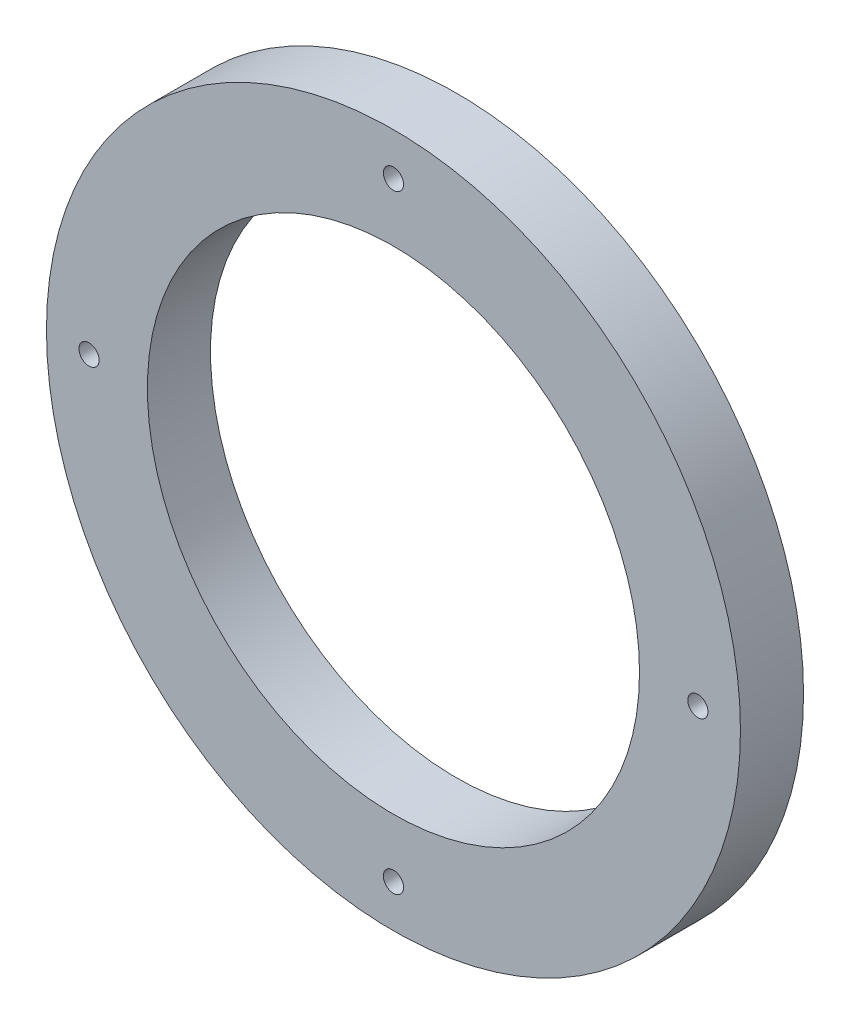
ISO-10303-21;
HEADER;
FILE_DESCRIPTION(('STEP AP214'),'2;1');
FILE_NAME('part.step','',(''),(''),'','','');
FILE_SCHEMA(('AUTOMOTIVE_DESIGN { 1 0 10303 214 1 1 1 1 }'));
ENDSEC;
DATA;
#1=APPLICATION_CONTEXT('core data for automotive mechanical design processes');
#2=APPLICATION_PROTOCOL_DEFINITION('international standard','automotive_design',2000,#1);
#3=PRODUCT_CONTEXT('',#1,'mechanical');
#4=PRODUCT('Part','Part','',(#3));
#5=PRODUCT_RELATED_PRODUCT_CATEGORY('part','',(#4));
#6=PRODUCT_DEFINITION_FORMATION('','',#4);
#7=PRODUCT_DEFINITION_CONTEXT('part definition',#1,'design');
#8=PRODUCT_DEFINITION('design','',#6,#7);
#9=PRODUCT_DEFINITION_SHAPE('','',#8);
#10=(LENGTH_UNIT() NAMED_UNIT(*) SI_UNIT(.MILLI.,.METRE.));
#11=(NAMED_UNIT(*) PLANE_ANGLE_UNIT() SI_UNIT($,.RADIAN.));
#12=(NAMED_UNIT(*) SI_UNIT($,.STERADIAN.) SOLID_ANGLE_UNIT());
#13=UNCERTAINTY_MEASURE_WITH_UNIT(LENGTH_MEASURE(1.E-05),#10,'distance_accuracy_value','');
#14=(GEOMETRIC_REPRESENTATION_CONTEXT(3) GLOBAL_UNCERTAINTY_ASSIGNED_CONTEXT((#13)) GLOBAL_UNIT_ASSIGNED_CONTEXT((#10,
#11,#12)) REPRESENTATION_CONTEXT('',''));
#15=CARTESIAN_POINT('',(0.,0.,0.));
#16=DIRECTION('',(0.,0.,1.));
#17=DIRECTION('',(1.,0.,0.));
#18=AXIS2_PLACEMENT_3D('',#15,#16,#17);
#19=CARTESIAN_POINT('',(0.,0.,10.));
#20=DIRECTION('',(0.,0.,1.));
#21=DIRECTION('',(1.,0.,0.));
#22=AXIS2_PLACEMENT_3D('',#19,#20,#21);
#23=PLANE('',#22);
#24=CARTESIAN_POINT('',(-3.36927949198362E-13,-48.25,10.));
#25=DIRECTION('',(0.,0.,1.));
#26=DIRECTION('',(1.,0.,0.));
#27=AXIS2_PLACEMENT_3D('',#24,#25,#26);
#28=CIRCLE('',#27,1.6);
#29=CARTESIAN_POINT('',(1.59999999999966,-48.25,10.));
#30=VERTEX_POINT('',#29);
#31=EDGE_CURVE('E67',#30,#30,#28,.T.);
#32=ORIENTED_EDGE('',*,*,#31,.F.);
#33=EDGE_LOOP('',(#32));
#34=FACE_BOUND('',#33,.T.);
#35=CARTESIAN_POINT('',(0.,48.25,10.));
#36=DIRECTION('',(0.,0.,1.));
#37=DIRECTION('',(1.,0.,0.));
#38=AXIS2_PLACEMENT_3D('',#35,#36,#37);
#39=CIRCLE('',#38,1.6);
#40=CARTESIAN_POINT('',(1.6,48.25,10.));
#41=VERTEX_POINT('',#40);
#42=EDGE_CURVE('E55',#41,#41,#39,.T.);
#43=ORIENTED_EDGE('',*,*,#42,.F.);
#44=EDGE_LOOP('',(#43));
#45=FACE_BOUND('',#44,.T.);
#46=CARTESIAN_POINT('',(0.,0.,10.));
#47=DIRECTION('',(0.,0.,1.));
#48=DIRECTION('',(1.,0.,0.));
#49=AXIS2_PLACEMENT_3D('',#46,#47,#48);
#50=CIRCLE('',#49,55.);
#51=CARTESIAN_POINT('',(55.,0.,10.));
#52=VERTEX_POINT('',#51);
#53=EDGE_CURVE('E10',#52,#52,#50,.T.);
#54=ORIENTED_EDGE('',*,*,#53,.T.);
#55=EDGE_LOOP('',(#54));
#56=FACE_BOUND('',#55,.T.);
#57=CARTESIAN_POINT('',(0.,0.,10.));
#58=DIRECTION('',(0.,0.,1.));
#59=DIRECTION('',(1.,0.,0.));
#60=AXIS2_PLACEMENT_3D('',#57,#58,#59);
#61=CIRCLE('',#60,39.);
#62=CARTESIAN_POINT('',(39.,0.,10.));
#63=VERTEX_POINT('',#62);
#64=EDGE_CURVE('E50',#63,#63,#61,.T.);
#65=ORIENTED_EDGE('',*,*,#64,.F.);
#66=EDGE_LOOP('',(#65));
#67=FACE_BOUND('',#66,.T.);
#68=CARTESIAN_POINT('',(48.25,-1.68463974599181E-13,10.));
#69=DIRECTION('',(0.,0.,1.));
#70=DIRECTION('',(1.,0.,0.));
#71=AXIS2_PLACEMENT_3D('',#68,#69,#70);
#72=CIRCLE('',#71,1.6);
#73=CARTESIAN_POINT('',(49.85,-1.68463974599181E-13,10.));
#74=VERTEX_POINT('',#73);
#75=EDGE_CURVE('E61',#74,#74,#72,.T.);
#76=ORIENTED_EDGE('',*,*,#75,.F.);
#77=EDGE_LOOP('',(#76));
#78=FACE_BOUND('',#77,.T.);
#79=CARTESIAN_POINT('',(-48.25,5.05391923797544E-13,10.));
#80=DIRECTION('',(0.,0.,1.));
#81=DIRECTION('',(1.,0.,0.));
#82=AXIS2_PLACEMENT_3D('',#79,#80,#81);
#83=CIRCLE('',#82,1.6);
#84=CARTESIAN_POINT('',(-46.65,5.05391923797544E-13,10.));
#85=VERTEX_POINT('',#84);
#86=EDGE_CURVE('E73',#85,#85,#83,.T.);
#87=ORIENTED_EDGE('',*,*,#86,.F.);
#88=EDGE_LOOP('',(#87));
#89=FACE_BOUND('',#88,.T.);
#90=ADVANCED_FACE('F39',(#34,#45,#56,#67,#78,#89),#23,.T.);
#91=CARTESIAN_POINT('',(0.,0.,0.));
#92=DIRECTION('',(0.,0.,1.));
#93=DIRECTION('',(1.,0.,0.));
#94=AXIS2_PLACEMENT_3D('',#91,#92,#93);
#95=PLANE('',#94);
#96=CARTESIAN_POINT('',(0.,0.,0.));
#97=DIRECTION('',(0.,0.,1.));
#98=DIRECTION('',(1.,0.,0.));
#99=AXIS2_PLACEMENT_3D('',#96,#97,#98);
#100=CIRCLE('',#99,55.);
#101=CARTESIAN_POINT('',(55.,0.,0.));
#102=VERTEX_POINT('',#101);
#103=EDGE_CURVE('E43',#102,#102,#100,.T.);
#104=ORIENTED_EDGE('',*,*,#103,.F.);
#105=EDGE_LOOP('',(#104));
#106=FACE_BOUND('',#105,.T.);
#107=CARTESIAN_POINT('',(0.,0.,0.));
#108=DIRECTION('',(0.,0.,1.));
#109=DIRECTION('',(1.,0.,0.));
#110=AXIS2_PLACEMENT_3D('',#107,#108,#109);
#111=CIRCLE('',#110,39.);
#112=CARTESIAN_POINT('',(39.,0.,0.));
#113=VERTEX_POINT('',#112);
#114=EDGE_CURVE('E52',#113,#113,#111,.T.);
#115=ORIENTED_EDGE('',*,*,#114,.T.);
#116=EDGE_LOOP('',(#115));
#117=FACE_BOUND('',#116,.T.);
#118=CARTESIAN_POINT('',(0.,48.25,0.));
#119=DIRECTION('',(0.,0.,1.));
#120=DIRECTION('',(1.,0.,0.));
#121=AXIS2_PLACEMENT_3D('',#118,#119,#120);
#122=CIRCLE('',#121,1.6);
#123=CARTESIAN_POINT('',(1.6,48.25,0.));
#124=VERTEX_POINT('',#123);
#125=EDGE_CURVE('E58',#124,#124,#122,.T.);
#126=ORIENTED_EDGE('',*,*,#125,.T.);
#127=EDGE_LOOP('',(#126));
#128=FACE_BOUND('',#127,.T.);
#129=CARTESIAN_POINT('',(48.25,-1.68463974599181E-13,0.));
#130=DIRECTION('',(0.,0.,1.));
#131=DIRECTION('',(1.,0.,0.));
#132=AXIS2_PLACEMENT_3D('',#129,#130,#131);
#133=CIRCLE('',#132,1.6);
#134=CARTESIAN_POINT('',(49.85,-1.68463974599181E-13,0.));
#135=VERTEX_POINT('',#134);
#136=EDGE_CURVE('E64',#135,#135,#133,.T.);
#137=ORIENTED_EDGE('',*,*,#136,.T.);
#138=EDGE_LOOP('',(#137));
#139=FACE_BOUND('',#138,.T.);
#140=CARTESIAN_POINT('',(-3.36927949198362E-13,-48.25,0.));
#141=DIRECTION('',(0.,0.,1.));
#142=DIRECTION('',(1.,0.,0.));
#143=AXIS2_PLACEMENT_3D('',#140,#141,#142);
#144=CIRCLE('',#143,1.6);
#145=CARTESIAN_POINT('',(1.59999999999966,-48.25,0.));
#146=VERTEX_POINT('',#145);
#147=EDGE_CURVE('E70',#146,#146,#144,.T.);
#148=ORIENTED_EDGE('',*,*,#147,.T.);
#149=EDGE_LOOP('',(#148));
#150=FACE_BOUND('',#149,.T.);
#151=CARTESIAN_POINT('',(-48.25,5.05391923797544E-13,0.));
#152=DIRECTION('',(0.,0.,1.));
#153=DIRECTION('',(1.,0.,0.));
#154=AXIS2_PLACEMENT_3D('',#151,#152,#153);
#155=CIRCLE('',#154,1.6);
#156=CARTESIAN_POINT('',(-46.65,5.05391923797544E-13,0.));
#157=VERTEX_POINT('',#156);
#158=EDGE_CURVE('E76',#157,#157,#155,.T.);
#159=ORIENTED_EDGE('',*,*,#158,.T.);
#160=EDGE_LOOP('',(#159));
#161=FACE_BOUND('',#160,.T.);
#162=ADVANCED_FACE('F86',(#106,#117,#128,#139,#150,#161),#95,.F.);
#163=CARTESIAN_POINT('',(0.,0.,10.));
#164=DIRECTION('',(0.,0.,-1.));
#165=DIRECTION('',(-1.,0.,0.));
#166=AXIS2_PLACEMENT_3D('',#163,#164,#165);
#167=CYLINDRICAL_SURFACE('',#166,55.);
#168=ORIENTED_EDGE('',*,*,#53,.F.);
#169=EDGE_LOOP('',(#168));
#170=FACE_BOUND('',#169,.T.);
#171=ORIENTED_EDGE('',*,*,#103,.T.);
#172=EDGE_LOOP('',(#171));
#173=FACE_BOUND('',#172,.T.);
#174=ADVANCED_FACE('F41',(#170,#173),#167,.T.);
#175=CARTESIAN_POINT('',(0.,0.,10.));
#176=DIRECTION('',(0.,0.,-1.));
#177=DIRECTION('',(-1.,0.,0.));
#178=AXIS2_PLACEMENT_3D('',#175,#176,#177);
#179=CYLINDRICAL_SURFACE('',#178,39.);
#180=ORIENTED_EDGE('',*,*,#64,.T.);
#181=EDGE_LOOP('',(#180));
#182=FACE_BOUND('',#181,.T.);
#183=ORIENTED_EDGE('',*,*,#114,.F.);
#184=EDGE_LOOP('',(#183));
#185=FACE_BOUND('',#184,.T.);
#186=ADVANCED_FACE('F96',(#182,#185),#179,.F.);
#187=CARTESIAN_POINT('',(0.,48.25,10.));
#188=DIRECTION('',(0.,0.,-1.));
#189=DIRECTION('',(-1.,0.,0.));
#190=AXIS2_PLACEMENT_3D('',#187,#188,#189);
#191=CYLINDRICAL_SURFACE('',#190,1.6);
#192=ORIENTED_EDGE('',*,*,#42,.T.);
#193=EDGE_LOOP('',(#192));
#194=FACE_BOUND('',#193,.T.);
#195=ORIENTED_EDGE('',*,*,#125,.F.);
#196=EDGE_LOOP('',(#195));
#197=FACE_BOUND('',#196,.T.);
#198=ADVANCED_FACE('F99',(#194,#197),#191,.F.);
#199=CARTESIAN_POINT('',(48.25,-1.68463974599181E-13,10.));
#200=DIRECTION('',(0.,0.,-1.));
#201=DIRECTION('',(-1.,0.,0.));
#202=AXIS2_PLACEMENT_3D('',#199,#200,#201);
#203=CYLINDRICAL_SURFACE('',#202,1.6);
#204=ORIENTED_EDGE('',*,*,#75,.T.);
#205=EDGE_LOOP('',(#204));
#206=FACE_BOUND('',#205,.T.);
#207=ORIENTED_EDGE('',*,*,#136,.F.);
#208=EDGE_LOOP('',(#207));
#209=FACE_BOUND('',#208,.T.);
#210=ADVANCED_FACE('F103',(#206,#209),#203,.F.);
#211=CARTESIAN_POINT('',(-3.36927949198362E-13,-48.25,10.));
#212=DIRECTION('',(0.,0.,-1.));
#213=DIRECTION('',(-1.,0.,0.));
#214=AXIS2_PLACEMENT_3D('',#211,#212,#213);
#215=CYLINDRICAL_SURFACE('',#214,1.6);
#216=ORIENTED_EDGE('',*,*,#31,.T.);
#217=EDGE_LOOP('',(#216));
#218=FACE_BOUND('',#217,.T.);
#219=ORIENTED_EDGE('',*,*,#147,.F.);
#220=EDGE_LOOP('',(#219));
#221=FACE_BOUND('',#220,.T.);
#222=ADVANCED_FACE('F107',(#218,#221),#215,.F.);
#223=CARTESIAN_POINT('',(-48.25,5.05391923797544E-13,10.));
#224=DIRECTION('',(0.,0.,-1.));
#225=DIRECTION('',(-1.,0.,0.));
#226=AXIS2_PLACEMENT_3D('',#223,#224,#225);
#227=CYLINDRICAL_SURFACE('',#226,1.6);
#228=ORIENTED_EDGE('',*,*,#86,.T.);
#229=EDGE_LOOP('',(#228));
#230=FACE_BOUND('',#229,.T.);
#231=ORIENTED_EDGE('',*,*,#158,.F.);
#232=EDGE_LOOP('',(#231));
#233=FACE_BOUND('',#232,.T.);
#234=ADVANCED_FACE('F82',(#230,#233),#227,.F.);
#235=CLOSED_SHELL('',(#90,#162,#174,#186,#198,#210,#222,#234));
#236=MANIFOLD_SOLID_BREP('B2',#235);
#237=ADVANCED_BREP_SHAPE_REPRESENTATION('',(#18,#236),#14);
#238=SHAPE_DEFINITION_REPRESENTATION(#9,#237);
ENDSEC;
END-ISO-10303-21;
